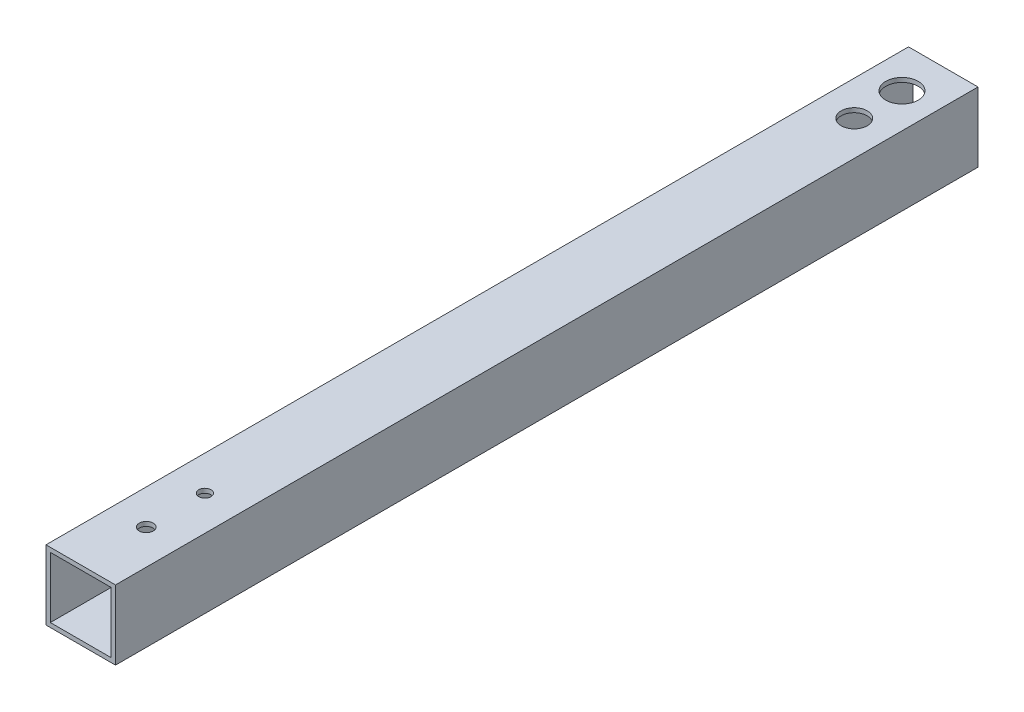
ISO-10303-21;
HEADER;
FILE_DESCRIPTION(('STEP AP214'),'2;1');
FILE_NAME('part.step','',(''),(''),'','','');
FILE_SCHEMA(('AUTOMOTIVE_DESIGN { 1 0 10303 214 1 1 1 1 }'));
ENDSEC;
DATA;
#1=APPLICATION_CONTEXT('core data for automotive mechanical design processes');
#2=APPLICATION_PROTOCOL_DEFINITION('international standard','automotive_design',2000,#1);
#3=PRODUCT_CONTEXT('',#1,'mechanical');
#4=PRODUCT('Part','Part','',(#3));
#5=PRODUCT_RELATED_PRODUCT_CATEGORY('part','',(#4));
#6=PRODUCT_DEFINITION_FORMATION('','',#4);
#7=PRODUCT_DEFINITION_CONTEXT('part definition',#1,'design');
#8=PRODUCT_DEFINITION('design','',#6,#7);
#9=PRODUCT_DEFINITION_SHAPE('','',#8);
#10=(LENGTH_UNIT() NAMED_UNIT(*) SI_UNIT(.MILLI.,.METRE.));
#11=(NAMED_UNIT(*) PLANE_ANGLE_UNIT() SI_UNIT($,.RADIAN.));
#12=(NAMED_UNIT(*) SI_UNIT($,.STERADIAN.) SOLID_ANGLE_UNIT());
#13=UNCERTAINTY_MEASURE_WITH_UNIT(LENGTH_MEASURE(1.E-05),#10,'distance_accuracy_value','');
#14=(GEOMETRIC_REPRESENTATION_CONTEXT(3) GLOBAL_UNCERTAINTY_ASSIGNED_CONTEXT((#13)) GLOBAL_UNIT_ASSIGNED_CONTEXT((#10,
#11,#12)) REPRESENTATION_CONTEXT('',''));
#15=CARTESIAN_POINT('',(0.,0.,0.));
#16=DIRECTION('',(0.,0.,1.));
#17=DIRECTION('',(1.,0.,0.));
#18=AXIS2_PLACEMENT_3D('',#15,#16,#17);
#19=CARTESIAN_POINT('',(0.,0.,0.));
#20=DIRECTION('',(0.,0.,-1.));
#21=DIRECTION('',(-1.,0.,0.));
#22=AXIS2_PLACEMENT_3D('',#19,#20,#21);
#23=PLANE('',#22);
#24=DIRECTION('',(0.,1.,0.));
#25=VECTOR('',#24,1.);
#26=CARTESIAN_POINT('',(8.,-8.,0.));
#27=LINE('',#26,#25);
#28=CARTESIAN_POINT('',(8.,-8.,0.));
#29=VERTEX_POINT('',#28);
#30=CARTESIAN_POINT('',(8.,8.,0.));
#31=VERTEX_POINT('',#30);
#32=EDGE_CURVE('E164',#29,#31,#27,.T.);
#33=ORIENTED_EDGE('',*,*,#32,.F.);
#34=DIRECTION('',(1.,0.,0.));
#35=VECTOR('',#34,1.);
#36=CARTESIAN_POINT('',(-8.,-8.,0.));
#37=LINE('',#36,#35);
#38=CARTESIAN_POINT('',(-8.,-8.,0.));
#39=VERTEX_POINT('',#38);
#40=EDGE_CURVE('E124',#39,#29,#37,.T.);
#41=ORIENTED_EDGE('',*,*,#40,.F.);
#42=DIRECTION('',(0.,-1.,0.));
#43=VECTOR('',#42,1.);
#44=CARTESIAN_POINT('',(-8.,-8.,0.));
#45=LINE('',#44,#43);
#46=CARTESIAN_POINT('',(-8.,8.,0.));
#47=VERTEX_POINT('',#46);
#48=EDGE_CURVE('E156',#47,#39,#45,.T.);
#49=ORIENTED_EDGE('',*,*,#48,.F.);
#50=DIRECTION('',(-1.,0.,0.));
#51=VECTOR('',#50,1.);
#52=CARTESIAN_POINT('',(-8.,8.,0.));
#53=LINE('',#52,#51);
#54=EDGE_CURVE('E151',#31,#47,#53,.T.);
#55=ORIENTED_EDGE('',*,*,#54,.F.);
#56=EDGE_LOOP('',(#33,#41,#49,#55));
#57=FACE_BOUND('',#56,.T.);
#58=DIRECTION('',(1.,0.,0.));
#59=VECTOR('',#58,1.);
#60=CARTESIAN_POINT('',(-7.,-7.,0.));
#61=LINE('',#60,#59);
#62=CARTESIAN_POINT('',(-7.,-7.,0.));
#63=VERTEX_POINT('',#62);
#64=CARTESIAN_POINT('',(7.,-7.,0.));
#65=VERTEX_POINT('',#64);
#66=EDGE_CURVE('E135',#63,#65,#61,.T.);
#67=ORIENTED_EDGE('',*,*,#66,.T.);
#68=DIRECTION('',(0.,1.,0.));
#69=VECTOR('',#68,1.);
#70=CARTESIAN_POINT('',(7.,-7.,0.));
#71=LINE('',#70,#69);
#72=CARTESIAN_POINT('',(7.,7.,0.));
#73=VERTEX_POINT('',#72);
#74=EDGE_CURVE('E119',#65,#73,#71,.T.);
#75=ORIENTED_EDGE('',*,*,#74,.T.);
#76=DIRECTION('',(-1.,0.,0.));
#77=VECTOR('',#76,1.);
#78=CARTESIAN_POINT('',(-7.,7.,0.));
#79=LINE('',#78,#77);
#80=CARTESIAN_POINT('',(-7.,7.,0.));
#81=VERTEX_POINT('',#80);
#82=EDGE_CURVE('E127',#73,#81,#79,.T.);
#83=ORIENTED_EDGE('',*,*,#82,.T.);
#84=DIRECTION('',(0.,-1.,0.));
#85=VECTOR('',#84,1.);
#86=CARTESIAN_POINT('',(-7.,-7.,0.));
#87=LINE('',#86,#85);
#88=EDGE_CURVE('E132',#81,#63,#87,.T.);
#89=ORIENTED_EDGE('',*,*,#88,.T.);
#90=EDGE_LOOP('',(#67,#75,#83,#89));
#91=FACE_BOUND('',#90,.T.);
#92=ADVANCED_FACE('F46',(#57,#91),#23,.T.);
#93=CARTESIAN_POINT('',(8.,-8.,221.203175144943));
#94=DIRECTION('',(-1.,0.,0.));
#95=DIRECTION('',(0.,0.,1.));
#96=AXIS2_PLACEMENT_3D('',#93,#94,#95);
#97=PLANE('',#96);
#98=DIRECTION('',(0.,0.,-1.));
#99=VECTOR('',#98,1.);
#100=CARTESIAN_POINT('',(8.,8.,221.203175144943));
#101=LINE('',#100,#99);
#102=CARTESIAN_POINT('',(8.,8.,198.575758146974));
#103=VERTEX_POINT('',#102);
#104=EDGE_CURVE('E148',#103,#31,#101,.T.);
#105=ORIENTED_EDGE('',*,*,#104,.F.);
#106=DIRECTION('',(0.,-1.,0.));
#107=VECTOR('',#106,1.);
#108=CARTESIAN_POINT('',(8.,-8.,198.575758146974));
#109=LINE('',#108,#107);
#110=CARTESIAN_POINT('',(8.,-8.,198.575758146974));
#111=VERTEX_POINT('',#110);
#112=EDGE_CURVE('E65',#103,#111,#109,.T.);
#113=ORIENTED_EDGE('',*,*,#112,.T.);
#114=DIRECTION('',(0.,0.,-1.));
#115=VECTOR('',#114,1.);
#116=CARTESIAN_POINT('',(8.,-8.,221.203175144943));
#117=LINE('',#116,#115);
#118=EDGE_CURVE('E162',#111,#29,#117,.T.);
#119=ORIENTED_EDGE('',*,*,#118,.T.);
#120=ORIENTED_EDGE('',*,*,#32,.T.);
#121=EDGE_LOOP('',(#105,#113,#119,#120));
#122=FACE_BOUND('',#121,.T.);
#123=ADVANCED_FACE('F255',(#122),#97,.F.);
#124=CARTESIAN_POINT('',(-8.,8.,221.203175144943));
#125=DIRECTION('',(0.,-1.,0.));
#126=DIRECTION('',(0.,0.,-1.));
#127=AXIS2_PLACEMENT_3D('',#124,#125,#126);
#128=PLANE('',#127);
#129=CARTESIAN_POINT('',(0.,8.,9.50000000000001));
#130=DIRECTION('',(0.,1.,0.));
#131=DIRECTION('',(0.,0.,1.));
#132=AXIS2_PLACEMENT_3D('',#129,#130,#131);
#133=CIRCLE('',#132,3.75);
#134=CARTESIAN_POINT('',(0.,8.,13.25));
#135=VERTEX_POINT('',#134);
#136=EDGE_CURVE('E465',#135,#135,#133,.T.);
#137=ORIENTED_EDGE('',*,*,#136,.F.);
#138=EDGE_LOOP('',(#137));
#139=FACE_BOUND('',#138,.T.);
#140=CARTESIAN_POINT('',(0.,8.,20.5));
#141=DIRECTION('',(0.,1.,0.));
#142=DIRECTION('',(0.,0.,1.));
#143=AXIS2_PLACEMENT_3D('',#140,#141,#142);
#144=CIRCLE('',#143,3.);
#145=CARTESIAN_POINT('',(0.,8.,23.5));
#146=VERTEX_POINT('',#145);
#147=EDGE_CURVE('E467',#146,#146,#144,.T.);
#148=ORIENTED_EDGE('',*,*,#147,.F.);
#149=EDGE_LOOP('',(#148));
#150=FACE_BOUND('',#149,.T.);
#151=CARTESIAN_POINT('',(-1.18542787272173E-13,8.,170.));
#152=DIRECTION('',(0.,1.,0.));
#153=DIRECTION('',(0.,0.,1.));
#154=AXIS2_PLACEMENT_3D('',#151,#152,#153);
#155=CIRCLE('',#154,1.4);
#156=CARTESIAN_POINT('',(-1.18542787272173E-13,8.,171.4));
#157=VERTEX_POINT('',#156);
#158=EDGE_CURVE('E479',#157,#157,#155,.T.);
#159=ORIENTED_EDGE('',*,*,#158,.F.);
#160=EDGE_LOOP('',(#159));
#161=FACE_BOUND('',#160,.T.);
#162=CARTESIAN_POINT('',(0.,8.,183.5));
#163=DIRECTION('',(0.,1.,0.));
#164=DIRECTION('',(0.,0.,1.));
#165=AXIS2_PLACEMENT_3D('',#162,#163,#164);
#166=CIRCLE('',#165,1.6);
#167=CARTESIAN_POINT('',(0.,8.,185.1));
#168=VERTEX_POINT('',#167);
#169=EDGE_CURVE('E486',#168,#168,#166,.T.);
#170=ORIENTED_EDGE('',*,*,#169,.F.);
#171=EDGE_LOOP('',(#170));
#172=FACE_BOUND('',#171,.T.);
#173=DIRECTION('',(0.,0.,-1.));
#174=VECTOR('',#173,1.);
#175=CARTESIAN_POINT('',(-8.,8.,221.203175144943));
#176=LINE('',#175,#174);
#177=CARTESIAN_POINT('',(-8.,8.,198.575758146974));
#178=VERTEX_POINT('',#177);
#179=EDGE_CURVE('E153',#178,#47,#176,.T.);
#180=ORIENTED_EDGE('',*,*,#179,.F.);
#181=DIRECTION('',(1.,0.,0.));
#182=VECTOR('',#181,1.);
#183=CARTESIAN_POINT('',(-8.,8.,198.575758146974));
#184=LINE('',#183,#182);
#185=EDGE_CURVE('E152',#178,#103,#184,.T.);
#186=ORIENTED_EDGE('',*,*,#185,.T.);
#187=ORIENTED_EDGE('',*,*,#104,.T.);
#188=ORIENTED_EDGE('',*,*,#54,.T.);
#189=EDGE_LOOP('',(#180,#186,#187,#188));
#190=FACE_BOUND('',#189,.T.);
#191=ADVANCED_FACE('F245',(#139,#150,#161,#172,#190),#128,.F.);
#192=CARTESIAN_POINT('',(-8.,-8.,221.203175144943));
#193=DIRECTION('',(1.,0.,0.));
#194=DIRECTION('',(0.,0.,-1.));
#195=AXIS2_PLACEMENT_3D('',#192,#193,#194);
#196=PLANE('',#195);
#197=DIRECTION('',(0.,0.,-1.));
#198=VECTOR('',#197,1.);
#199=CARTESIAN_POINT('',(-8.,-8.,221.203175144943));
#200=LINE('',#199,#198);
#201=CARTESIAN_POINT('',(-8.,-8.,198.575758146974));
#202=VERTEX_POINT('',#201);
#203=EDGE_CURVE('E158',#202,#39,#200,.T.);
#204=ORIENTED_EDGE('',*,*,#203,.F.);
#205=DIRECTION('',(0.,1.,0.));
#206=VECTOR('',#205,1.);
#207=CARTESIAN_POINT('',(-8.,-8.,198.575758146974));
#208=LINE('',#207,#206);
#209=EDGE_CURVE('E157',#202,#178,#208,.T.);
#210=ORIENTED_EDGE('',*,*,#209,.T.);
#211=ORIENTED_EDGE('',*,*,#179,.T.);
#212=ORIENTED_EDGE('',*,*,#48,.T.);
#213=EDGE_LOOP('',(#204,#210,#211,#212));
#214=FACE_BOUND('',#213,.T.);
#215=ADVANCED_FACE('F249',(#214),#196,.F.);
#216=CARTESIAN_POINT('',(-8.,-8.,221.203175144943));
#217=DIRECTION('',(0.,1.,0.));
#218=DIRECTION('',(0.,0.,1.));
#219=AXIS2_PLACEMENT_3D('',#216,#217,#218);
#220=PLANE('',#219);
#221=CARTESIAN_POINT('',(0.,-8.,9.50000000000001));
#222=DIRECTION('',(0.,1.,0.));
#223=DIRECTION('',(0.,0.,1.));
#224=AXIS2_PLACEMENT_3D('',#221,#222,#223);
#225=CIRCLE('',#224,3.75);
#226=CARTESIAN_POINT('',(0.,-8.,13.25));
#227=VERTEX_POINT('',#226);
#228=EDGE_CURVE('E192',#227,#227,#225,.T.);
#229=ORIENTED_EDGE('',*,*,#228,.T.);
#230=EDGE_LOOP('',(#229));
#231=FACE_BOUND('',#230,.T.);
#232=CARTESIAN_POINT('',(0.,-8.,20.5));
#233=DIRECTION('',(0.,1.,0.));
#234=DIRECTION('',(0.,0.,1.));
#235=AXIS2_PLACEMENT_3D('',#232,#233,#234);
#236=CIRCLE('',#235,3.);
#237=CARTESIAN_POINT('',(0.,-8.,23.5));
#238=VERTEX_POINT('',#237);
#239=EDGE_CURVE('E474',#238,#238,#236,.T.);
#240=ORIENTED_EDGE('',*,*,#239,.T.);
#241=EDGE_LOOP('',(#240));
#242=FACE_BOUND('',#241,.T.);
#243=CARTESIAN_POINT('',(-1.18542787272173E-13,-8.,170.));
#244=DIRECTION('',(0.,1.,0.));
#245=DIRECTION('',(0.,0.,1.));
#246=AXIS2_PLACEMENT_3D('',#243,#244,#245);
#247=CIRCLE('',#246,1.4);
#248=CARTESIAN_POINT('',(-1.18542787272173E-13,-8.,171.4));
#249=VERTEX_POINT('',#248);
#250=EDGE_CURVE('E482',#249,#249,#247,.T.);
#251=ORIENTED_EDGE('',*,*,#250,.T.);
#252=EDGE_LOOP('',(#251));
#253=FACE_BOUND('',#252,.T.);
#254=CARTESIAN_POINT('',(0.,-8.,183.5));
#255=DIRECTION('',(0.,1.,0.));
#256=DIRECTION('',(0.,0.,1.));
#257=AXIS2_PLACEMENT_3D('',#254,#255,#256);
#258=CIRCLE('',#257,1.6);
#259=CARTESIAN_POINT('',(0.,-8.,185.1));
#260=VERTEX_POINT('',#259);
#261=EDGE_CURVE('E489',#260,#260,#258,.T.);
#262=ORIENTED_EDGE('',*,*,#261,.T.);
#263=EDGE_LOOP('',(#262));
#264=FACE_BOUND('',#263,.T.);
#265=ORIENTED_EDGE('',*,*,#118,.F.);
#266=DIRECTION('',(-1.,0.,0.));
#267=VECTOR('',#266,1.);
#268=CARTESIAN_POINT('',(-8.,-8.,198.575758146974));
#269=LINE('',#268,#267);
#270=EDGE_CURVE('E161',#111,#202,#269,.T.);
#271=ORIENTED_EDGE('',*,*,#270,.T.);
#272=ORIENTED_EDGE('',*,*,#203,.T.);
#273=ORIENTED_EDGE('',*,*,#40,.T.);
#274=EDGE_LOOP('',(#265,#271,#272,#273));
#275=FACE_BOUND('',#274,.T.);
#276=ADVANCED_FACE('F253',(#231,#242,#253,#264,#275),#220,.F.);
#277=CARTESIAN_POINT('',(7.,-7.,221.203175144943));
#278=DIRECTION('',(-1.,0.,0.));
#279=DIRECTION('',(0.,0.,1.));
#280=AXIS2_PLACEMENT_3D('',#277,#278,#279);
#281=PLANE('',#280);
#282=DIRECTION('',(0.,-1.,0.));
#283=VECTOR('',#282,1.);
#284=CARTESIAN_POINT('',(7.,-7.,198.575758146974));
#285=LINE('',#284,#283);
#286=CARTESIAN_POINT('',(7.,7.,198.575758146974));
#287=VERTEX_POINT('',#286);
#288=CARTESIAN_POINT('',(7.,-7.,198.575758146974));
#289=VERTEX_POINT('',#288);
#290=EDGE_CURVE('E122',#287,#289,#285,.T.);
#291=ORIENTED_EDGE('',*,*,#290,.F.);
#292=DIRECTION('',(0.,0.,-1.));
#293=VECTOR('',#292,1.);
#294=CARTESIAN_POINT('',(7.,7.,221.203175144943));
#295=LINE('',#294,#293);
#296=EDGE_CURVE('E115',#287,#73,#295,.T.);
#297=ORIENTED_EDGE('',*,*,#296,.T.);
#298=ORIENTED_EDGE('',*,*,#74,.F.);
#299=DIRECTION('',(0.,0.,-1.));
#300=VECTOR('',#299,1.);
#301=CARTESIAN_POINT('',(7.,-7.,221.203175144943));
#302=LINE('',#301,#300);
#303=EDGE_CURVE('E171',#289,#65,#302,.T.);
#304=ORIENTED_EDGE('',*,*,#303,.F.);
#305=EDGE_LOOP('',(#291,#297,#298,#304));
#306=FACE_BOUND('',#305,.T.);
#307=ADVANCED_FACE('F116',(#306),#281,.T.);
#308=CARTESIAN_POINT('',(-7.,7.,221.203175144943));
#309=DIRECTION('',(0.,-1.,0.));
#310=DIRECTION('',(0.,0.,-1.));
#311=AXIS2_PLACEMENT_3D('',#308,#309,#310);
#312=PLANE('',#311);
#313=CARTESIAN_POINT('',(0.,7.,9.50000000000001));
#314=DIRECTION('',(0.,-1.,0.));
#315=DIRECTION('',(0.,0.,-1.));
#316=AXIS2_PLACEMENT_3D('',#313,#314,#315);
#317=CIRCLE('',#316,3.75);
#318=CARTESIAN_POINT('',(0.,7.,5.75000000000001));
#319=VERTEX_POINT('',#318);
#320=EDGE_CURVE('E140',#319,#319,#317,.T.);
#321=ORIENTED_EDGE('',*,*,#320,.F.);
#322=EDGE_LOOP('',(#321));
#323=FACE_BOUND('',#322,.T.);
#324=CARTESIAN_POINT('',(0.,7.,20.5));
#325=DIRECTION('',(0.,-1.,0.));
#326=DIRECTION('',(0.,0.,-1.));
#327=AXIS2_PLACEMENT_3D('',#324,#325,#326);
#328=CIRCLE('',#327,3.);
#329=CARTESIAN_POINT('',(0.,7.,17.5));
#330=VERTEX_POINT('',#329);
#331=EDGE_CURVE('E200',#330,#330,#328,.T.);
#332=ORIENTED_EDGE('',*,*,#331,.F.);
#333=EDGE_LOOP('',(#332));
#334=FACE_BOUND('',#333,.T.);
#335=CARTESIAN_POINT('',(-1.18542787272173E-13,7.,170.));
#336=DIRECTION('',(0.,-1.,0.));
#337=DIRECTION('',(0.,0.,-1.));
#338=AXIS2_PLACEMENT_3D('',#335,#336,#337);
#339=CIRCLE('',#338,1.4);
#340=CARTESIAN_POINT('',(-1.18542787272173E-13,7.,168.6));
#341=VERTEX_POINT('',#340);
#342=EDGE_CURVE('E196',#341,#341,#339,.T.);
#343=ORIENTED_EDGE('',*,*,#342,.F.);
#344=EDGE_LOOP('',(#343));
#345=FACE_BOUND('',#344,.T.);
#346=CARTESIAN_POINT('',(0.,7.,183.5));
#347=DIRECTION('',(0.,-1.,0.));
#348=DIRECTION('',(0.,0.,-1.));
#349=AXIS2_PLACEMENT_3D('',#346,#347,#348);
#350=CIRCLE('',#349,1.6);
#351=CARTESIAN_POINT('',(0.,7.,181.9));
#352=VERTEX_POINT('',#351);
#353=EDGE_CURVE('E191',#352,#352,#350,.T.);
#354=ORIENTED_EDGE('',*,*,#353,.F.);
#355=EDGE_LOOP('',(#354));
#356=FACE_BOUND('',#355,.T.);
#357=DIRECTION('',(1.,0.,0.));
#358=VECTOR('',#357,1.);
#359=CARTESIAN_POINT('',(-7.,7.,198.575758146974));
#360=LINE('',#359,#358);
#361=CARTESIAN_POINT('',(-7.,7.,198.575758146974));
#362=VERTEX_POINT('',#361);
#363=EDGE_CURVE('E11',#362,#287,#360,.T.);
#364=ORIENTED_EDGE('',*,*,#363,.F.);
#365=DIRECTION('',(0.,0.,-1.));
#366=VECTOR('',#365,1.);
#367=CARTESIAN_POINT('',(-7.,7.,221.203175144943));
#368=LINE('',#367,#366);
#369=EDGE_CURVE('E108',#362,#81,#368,.T.);
#370=ORIENTED_EDGE('',*,*,#369,.T.);
#371=ORIENTED_EDGE('',*,*,#82,.F.);
#372=ORIENTED_EDGE('',*,*,#296,.F.);
#373=EDGE_LOOP('',(#364,#370,#371,#372));
#374=FACE_BOUND('',#373,.T.);
#375=ADVANCED_FACE('F128',(#323,#334,#345,#356,#374),#312,.T.);
#376=CARTESIAN_POINT('',(-7.,-7.,221.203175144943));
#377=DIRECTION('',(1.,0.,0.));
#378=DIRECTION('',(0.,0.,-1.));
#379=AXIS2_PLACEMENT_3D('',#376,#377,#378);
#380=PLANE('',#379);
#381=DIRECTION('',(0.,1.,0.));
#382=VECTOR('',#381,1.);
#383=CARTESIAN_POINT('',(-7.,-7.,198.575758146974));
#384=LINE('',#383,#382);
#385=CARTESIAN_POINT('',(-7.,-7.,198.575758146974));
#386=VERTEX_POINT('',#385);
#387=EDGE_CURVE('E56',#386,#362,#384,.T.);
#388=ORIENTED_EDGE('',*,*,#387,.F.);
#389=DIRECTION('',(0.,0.,-1.));
#390=VECTOR('',#389,1.);
#391=CARTESIAN_POINT('',(-7.,-7.,221.203175144943));
#392=LINE('',#391,#390);
#393=EDGE_CURVE('E168',#386,#63,#392,.T.);
#394=ORIENTED_EDGE('',*,*,#393,.T.);
#395=ORIENTED_EDGE('',*,*,#88,.F.);
#396=ORIENTED_EDGE('',*,*,#369,.F.);
#397=EDGE_LOOP('',(#388,#394,#395,#396));
#398=FACE_BOUND('',#397,.T.);
#399=ADVANCED_FACE('F233',(#398),#380,.T.);
#400=CARTESIAN_POINT('',(-7.,-7.,221.203175144943));
#401=DIRECTION('',(0.,1.,0.));
#402=DIRECTION('',(0.,0.,1.));
#403=AXIS2_PLACEMENT_3D('',#400,#401,#402);
#404=PLANE('',#403);
#405=CARTESIAN_POINT('',(0.,-7.,9.50000000000001));
#406=DIRECTION('',(0.,1.,0.));
#407=DIRECTION('',(0.,0.,1.));
#408=AXIS2_PLACEMENT_3D('',#405,#406,#407);
#409=CIRCLE('',#408,3.75);
#410=CARTESIAN_POINT('',(0.,-7.,13.25));
#411=VERTEX_POINT('',#410);
#412=EDGE_CURVE('E50',#411,#411,#409,.T.);
#413=ORIENTED_EDGE('',*,*,#412,.F.);
#414=EDGE_LOOP('',(#413));
#415=FACE_BOUND('',#414,.T.);
#416=CARTESIAN_POINT('',(0.,-7.,20.5));
#417=DIRECTION('',(0.,1.,0.));
#418=DIRECTION('',(0.,0.,1.));
#419=AXIS2_PLACEMENT_3D('',#416,#417,#418);
#420=CIRCLE('',#419,3.);
#421=CARTESIAN_POINT('',(0.,-7.,23.5));
#422=VERTEX_POINT('',#421);
#423=EDGE_CURVE('E197',#422,#422,#420,.T.);
#424=ORIENTED_EDGE('',*,*,#423,.F.);
#425=EDGE_LOOP('',(#424));
#426=FACE_BOUND('',#425,.T.);
#427=CARTESIAN_POINT('',(-1.18542787272173E-13,-7.,170.));
#428=DIRECTION('',(0.,1.,0.));
#429=DIRECTION('',(0.,0.,1.));
#430=AXIS2_PLACEMENT_3D('',#427,#428,#429);
#431=CIRCLE('',#430,1.4);
#432=CARTESIAN_POINT('',(-1.18542787272173E-13,-7.,171.4));
#433=VERTEX_POINT('',#432);
#434=EDGE_CURVE('E193',#433,#433,#431,.T.);
#435=ORIENTED_EDGE('',*,*,#434,.F.);
#436=EDGE_LOOP('',(#435));
#437=FACE_BOUND('',#436,.T.);
#438=CARTESIAN_POINT('',(0.,-7.,183.5));
#439=DIRECTION('',(0.,1.,0.));
#440=DIRECTION('',(0.,0.,1.));
#441=AXIS2_PLACEMENT_3D('',#438,#439,#440);
#442=CIRCLE('',#441,1.6);
#443=CARTESIAN_POINT('',(0.,-7.,185.1));
#444=VERTEX_POINT('',#443);
#445=EDGE_CURVE('E187',#444,#444,#442,.T.);
#446=ORIENTED_EDGE('',*,*,#445,.F.);
#447=EDGE_LOOP('',(#446));
#448=FACE_BOUND('',#447,.T.);
#449=DIRECTION('',(-1.,0.,0.));
#450=VECTOR('',#449,1.);
#451=CARTESIAN_POINT('',(-7.,-7.,198.575758146974));
#452=LINE('',#451,#450);
#453=EDGE_CURVE('E144',#289,#386,#452,.T.);
#454=ORIENTED_EDGE('',*,*,#453,.F.);
#455=ORIENTED_EDGE('',*,*,#303,.T.);
#456=ORIENTED_EDGE('',*,*,#66,.F.);
#457=ORIENTED_EDGE('',*,*,#393,.F.);
#458=EDGE_LOOP('',(#454,#455,#456,#457));
#459=FACE_BOUND('',#458,.T.);
#460=ADVANCED_FACE('F238',(#415,#426,#437,#448,#459),#404,.T.);
#461=CARTESIAN_POINT('',(8.09753048774748,16.4071985940735,198.575758146974));
#462=DIRECTION('',(0.,0.,-1.));
#463=DIRECTION('',(-1.,0.,0.));
#464=AXIS2_PLACEMENT_3D('',#461,#462,#463);
#465=PLANE('',#464);
#466=ORIENTED_EDGE('',*,*,#290,.T.);
#467=ORIENTED_EDGE('',*,*,#453,.T.);
#468=ORIENTED_EDGE('',*,*,#387,.T.);
#469=ORIENTED_EDGE('',*,*,#363,.T.);
#470=EDGE_LOOP('',(#466,#467,#468,#469));
#471=FACE_BOUND('',#470,.T.);
#472=ORIENTED_EDGE('',*,*,#185,.F.);
#473=ORIENTED_EDGE('',*,*,#209,.F.);
#474=ORIENTED_EDGE('',*,*,#270,.F.);
#475=ORIENTED_EDGE('',*,*,#112,.F.);
#476=EDGE_LOOP('',(#472,#473,#474,#475));
#477=FACE_BOUND('',#476,.T.);
#478=ADVANCED_FACE('F48',(#471,#477),#465,.F.);
#479=CARTESIAN_POINT('',(0.,-8.,183.5));
#480=DIRECTION('',(0.,1.,0.));
#481=DIRECTION('',(0.,0.,1.));
#482=AXIS2_PLACEMENT_3D('',#479,#480,#481);
#483=CYLINDRICAL_SURFACE('',#482,1.6);
#484=ORIENTED_EDGE('',*,*,#445,.T.);
#485=EDGE_LOOP('',(#484));
#486=FACE_BOUND('',#485,.T.);
#487=ORIENTED_EDGE('',*,*,#261,.F.);
#488=EDGE_LOOP('',(#487));
#489=FACE_BOUND('',#488,.T.);
#490=ADVANCED_FACE('F266',(#486,#489),#483,.F.);
#491=CARTESIAN_POINT('',(-1.18542787272173E-13,-8.,170.));
#492=DIRECTION('',(0.,1.,0.));
#493=DIRECTION('',(0.,0.,1.));
#494=AXIS2_PLACEMENT_3D('',#491,#492,#493);
#495=CYLINDRICAL_SURFACE('',#494,1.4);
#496=ORIENTED_EDGE('',*,*,#434,.T.);
#497=EDGE_LOOP('',(#496));
#498=FACE_BOUND('',#497,.T.);
#499=ORIENTED_EDGE('',*,*,#250,.F.);
#500=EDGE_LOOP('',(#499));
#501=FACE_BOUND('',#500,.T.);
#502=ADVANCED_FACE('F311',(#498,#501),#495,.F.);
#503=CARTESIAN_POINT('',(0.,-8.,20.5));
#504=DIRECTION('',(0.,1.,0.));
#505=DIRECTION('',(0.,0.,1.));
#506=AXIS2_PLACEMENT_3D('',#503,#504,#505);
#507=CYLINDRICAL_SURFACE('',#506,3.);
#508=ORIENTED_EDGE('',*,*,#423,.T.);
#509=EDGE_LOOP('',(#508));
#510=FACE_BOUND('',#509,.T.);
#511=ORIENTED_EDGE('',*,*,#239,.F.);
#512=EDGE_LOOP('',(#511));
#513=FACE_BOUND('',#512,.T.);
#514=ADVANCED_FACE('F320',(#510,#513),#507,.F.);
#515=CARTESIAN_POINT('',(0.,-8.,9.50000000000001));
#516=DIRECTION('',(0.,1.,0.));
#517=DIRECTION('',(0.,0.,1.));
#518=AXIS2_PLACEMENT_3D('',#515,#516,#517);
#519=CYLINDRICAL_SURFACE('',#518,3.75);
#520=ORIENTED_EDGE('',*,*,#412,.T.);
#521=EDGE_LOOP('',(#520));
#522=FACE_BOUND('',#521,.T.);
#523=ORIENTED_EDGE('',*,*,#228,.F.);
#524=EDGE_LOOP('',(#523));
#525=FACE_BOUND('',#524,.T.);
#526=ADVANCED_FACE('F326',(#522,#525),#519,.F.);
#527=ORIENTED_EDGE('',*,*,#353,.T.);
#528=EDGE_LOOP('',(#527));
#529=FACE_BOUND('',#528,.T.);
#530=ORIENTED_EDGE('',*,*,#169,.T.);
#531=EDGE_LOOP('',(#530));
#532=FACE_BOUND('',#531,.T.);
#533=ADVANCED_FACE('F313',(#529,#532),#483,.F.);
#534=ORIENTED_EDGE('',*,*,#342,.T.);
#535=EDGE_LOOP('',(#534));
#536=FACE_BOUND('',#535,.T.);
#537=ORIENTED_EDGE('',*,*,#158,.T.);
#538=EDGE_LOOP('',(#537));
#539=FACE_BOUND('',#538,.T.);
#540=ADVANCED_FACE('F322',(#536,#539),#495,.F.);
#541=ORIENTED_EDGE('',*,*,#331,.T.);
#542=EDGE_LOOP('',(#541));
#543=FACE_BOUND('',#542,.T.);
#544=ORIENTED_EDGE('',*,*,#147,.T.);
#545=EDGE_LOOP('',(#544));
#546=FACE_BOUND('',#545,.T.);
#547=ADVANCED_FACE('F328',(#543,#546),#507,.F.);
#548=ORIENTED_EDGE('',*,*,#320,.T.);
#549=EDGE_LOOP('',(#548));
#550=FACE_BOUND('',#549,.T.);
#551=ORIENTED_EDGE('',*,*,#136,.T.);
#552=EDGE_LOOP('',(#551));
#553=FACE_BOUND('',#552,.T.);
#554=ADVANCED_FACE('F336',(#550,#553),#519,.F.);
#555=CLOSED_SHELL('',(#92,#123,#191,#215,#276,#307,#375,#399,#460,#478,#490,#502,#514,#526,#533,
#540,#547,#554));
#556=MANIFOLD_SOLID_BREP('B2',#555);
#557=ADVANCED_BREP_SHAPE_REPRESENTATION('',(#18,#556),#14);
#558=SHAPE_DEFINITION_REPRESENTATION(#9,#557);
ENDSEC;
END-ISO-10303-21;
